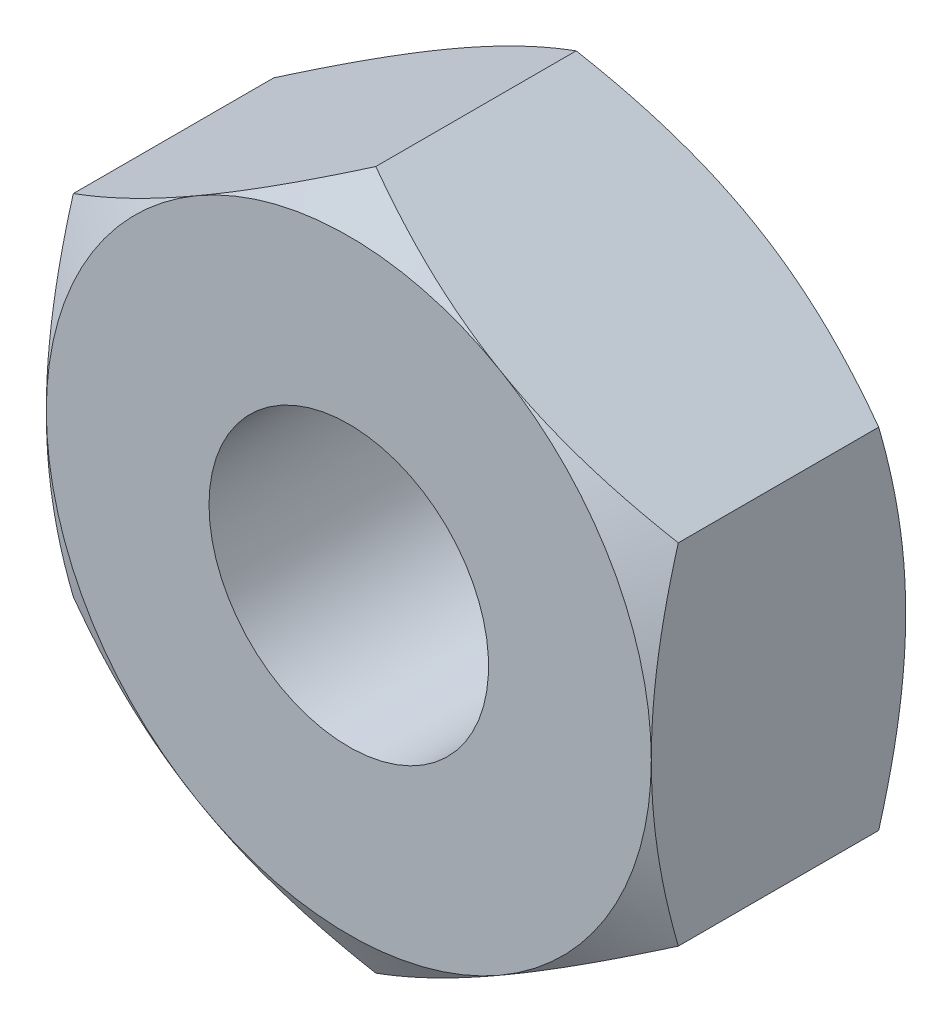
ISO-10303-21;
HEADER;
FILE_DESCRIPTION(('STEP AP214'),'2;1');
FILE_NAME('part.step','',(''),(''),'','','');
FILE_SCHEMA(('AUTOMOTIVE_DESIGN { 1 0 10303 214 1 1 1 1 }'));
ENDSEC;
DATA;
#1=APPLICATION_CONTEXT('core data for automotive mechanical design processes');
#2=APPLICATION_PROTOCOL_DEFINITION('international standard','automotive_design',2000,#1);
#3=PRODUCT_CONTEXT('',#1,'mechanical');
#4=PRODUCT('Part','Part','',(#3));
#5=PRODUCT_RELATED_PRODUCT_CATEGORY('part','',(#4));
#6=PRODUCT_DEFINITION_FORMATION('','',#4);
#7=PRODUCT_DEFINITION_CONTEXT('part definition',#1,'design');
#8=PRODUCT_DEFINITION('design','',#6,#7);
#9=PRODUCT_DEFINITION_SHAPE('','',#8);
#10=(LENGTH_UNIT() NAMED_UNIT(*) SI_UNIT(.MILLI.,.METRE.));
#11=(NAMED_UNIT(*) PLANE_ANGLE_UNIT() SI_UNIT($,.RADIAN.));
#12=(NAMED_UNIT(*) SI_UNIT($,.STERADIAN.) SOLID_ANGLE_UNIT());
#13=UNCERTAINTY_MEASURE_WITH_UNIT(LENGTH_MEASURE(1.E-05),#10,'distance_accuracy_value','');
#14=(GEOMETRIC_REPRESENTATION_CONTEXT(3) GLOBAL_UNCERTAINTY_ASSIGNED_CONTEXT((#13)) GLOBAL_UNIT_ASSIGNED_CONTEXT((#10,
#11,#12)) REPRESENTATION_CONTEXT('',''));
#15=CARTESIAN_POINT('',(0.,0.,0.));
#16=DIRECTION('',(0.,0.,1.));
#17=DIRECTION('',(1.,0.,0.));
#18=AXIS2_PLACEMENT_3D('',#15,#16,#17);
#19=CARTESIAN_POINT('',(-2.705,-3.12346495631587,0.));
#20=DIRECTION('',(0.,0.,1.));
#21=DIRECTION('',(1.,0.,0.));
#22=AXIS2_PLACEMENT_3D('',#19,#20,#21);
#23=PLANE('',#22);
#24=CARTESIAN_POINT('',(0.,0.,0.));
#25=DIRECTION('',(0.,0.,1.));
#26=DIRECTION('',(0.,-1.,0.));
#27=AXIS2_PLACEMENT_3D('',#24,#25,#26);
#28=CIRCLE('',#27,2.70500000000018);
#29=CARTESIAN_POINT('',(2.70500000000018,0.,0.));
#30=VERTEX_POINT('',#29);
#31=CARTESIAN_POINT('',(1.35250000000009,2.34259871723707,0.));
#32=VERTEX_POINT('',#31);
#33=EDGE_CURVE('E369',#30,#32,#28,.T.);
#34=ORIENTED_EDGE('',*,*,#33,.F.);
#35=CARTESIAN_POINT('',(0.,0.,0.));
#36=DIRECTION('',(0.,0.,1.));
#37=DIRECTION('',(1.,0.,0.));
#38=AXIS2_PLACEMENT_3D('',#35,#36,#37);
#39=CIRCLE('',#38,2.70500000000021);
#40=CARTESIAN_POINT('',(1.35250000000009,-2.34259871723706,0.));
#41=VERTEX_POINT('',#40);
#42=EDGE_CURVE('E12',#30,#41,#39,.F.);
#43=ORIENTED_EDGE('',*,*,#42,.T.);
#44=CARTESIAN_POINT('',(-1.35250000000009,-2.34259871723706,0.));
#45=VERTEX_POINT('',#44);
#46=EDGE_CURVE('E55',#41,#45,#39,.F.);
#47=ORIENTED_EDGE('',*,*,#46,.T.);
#48=CARTESIAN_POINT('',(-2.70500000000018,0.,0.));
#49=VERTEX_POINT('',#48);
#50=EDGE_CURVE('E646',#45,#49,#39,.F.);
#51=ORIENTED_EDGE('',*,*,#50,.T.);
#52=CARTESIAN_POINT('',(-1.35250000000009,2.34259871723707,0.));
#53=VERTEX_POINT('',#52);
#54=EDGE_CURVE('E651',#49,#53,#39,.F.);
#55=ORIENTED_EDGE('',*,*,#54,.T.);
#56=EDGE_CURVE('E56',#53,#32,#39,.F.);
#57=ORIENTED_EDGE('',*,*,#56,.T.);
#58=EDGE_LOOP('',(#34,#43,#47,#51,#55,#57));
#59=FACE_BOUND('',#58,.T.);
#60=CARTESIAN_POINT('',(0.,0.,0.));
#61=DIRECTION('',(0.,0.,-1.));
#62=DIRECTION('',(-1.,0.,0.));
#63=AXIS2_PLACEMENT_3D('',#60,#61,#62);
#64=CIRCLE('',#63,1.24999999999999);
#65=CARTESIAN_POINT('',(-1.24999999999999,0.,0.));
#66=VERTEX_POINT('',#65);
#67=EDGE_CURVE('E684',#66,#66,#64,.T.);
#68=ORIENTED_EDGE('',*,*,#67,.F.);
#69=EDGE_LOOP('',(#68));
#70=FACE_BOUND('',#69,.T.);
#71=ADVANCED_FACE('F45',(#59,#70),#23,.F.);
#72=CARTESIAN_POINT('',(-2.705,-3.12346495631587,2.275));
#73=DIRECTION('',(0.,0.,1.));
#74=DIRECTION('',(1.,0.,0.));
#75=AXIS2_PLACEMENT_3D('',#72,#73,#74);
#76=PLANE('',#75);
#77=CARTESIAN_POINT('',(0.,0.,2.275));
#78=DIRECTION('',(0.,0.,-1.));
#79=DIRECTION('',(0.,1.,0.));
#80=AXIS2_PLACEMENT_3D('',#77,#78,#79);
#81=CIRCLE('',#80,2.70500000000018);
#82=CARTESIAN_POINT('',(2.70500000000018,0.,2.275));
#83=VERTEX_POINT('',#82);
#84=CARTESIAN_POINT('',(1.35250000000009,-2.34259871723706,2.275));
#85=VERTEX_POINT('',#84);
#86=EDGE_CURVE('E212',#83,#85,#81,.T.);
#87=ORIENTED_EDGE('',*,*,#86,.F.);
#88=CARTESIAN_POINT('',(0.,0.,2.275));
#89=DIRECTION('',(0.,0.,1.));
#90=DIRECTION('',(1.,0.,0.));
#91=AXIS2_PLACEMENT_3D('',#88,#89,#90);
#92=CIRCLE('',#91,2.70500000000018);
#93=CARTESIAN_POINT('',(1.35250000000009,2.34259871723706,2.275));
#94=VERTEX_POINT('',#93);
#95=EDGE_CURVE('E188',#94,#83,#92,.F.);
#96=ORIENTED_EDGE('',*,*,#95,.F.);
#97=CARTESIAN_POINT('',(-1.35250000000009,2.34259871723706,2.275));
#98=VERTEX_POINT('',#97);
#99=EDGE_CURVE('E196',#98,#94,#92,.F.);
#100=ORIENTED_EDGE('',*,*,#99,.F.);
#101=CARTESIAN_POINT('',(-2.70500000000018,0.,2.275));
#102=VERTEX_POINT('',#101);
#103=EDGE_CURVE('E668',#102,#98,#92,.F.);
#104=ORIENTED_EDGE('',*,*,#103,.F.);
#105=CARTESIAN_POINT('',(-1.35250000000009,-2.34259871723707,2.275));
#106=VERTEX_POINT('',#105);
#107=EDGE_CURVE('E663',#106,#102,#92,.F.);
#108=ORIENTED_EDGE('',*,*,#107,.F.);
#109=EDGE_CURVE('E197',#85,#106,#92,.F.);
#110=ORIENTED_EDGE('',*,*,#109,.F.);
#111=EDGE_LOOP('',(#87,#96,#100,#104,#108,#110));
#112=FACE_BOUND('',#111,.T.);
#113=CARTESIAN_POINT('',(0.,0.,2.27500000000011));
#114=DIRECTION('',(0.,0.,-1.));
#115=DIRECTION('',(-1.,0.,0.));
#116=AXIS2_PLACEMENT_3D('',#113,#114,#115);
#117=CIRCLE('',#116,1.24999999999999);
#118=CARTESIAN_POINT('',(-1.24999999999999,0.,2.27500000000011));
#119=VERTEX_POINT('',#118);
#120=EDGE_CURVE('E455',#119,#119,#117,.T.);
#121=ORIENTED_EDGE('',*,*,#120,.T.);
#122=EDGE_LOOP('',(#121));
#123=FACE_BOUND('',#122,.T.);
#124=ADVANCED_FACE('F276',(#112,#123),#76,.T.);
#125=CARTESIAN_POINT('',(2.705,1.56173247815794,2.275));
#126=DIRECTION('',(-0.5,-0.866025403784439,0.));
#127=DIRECTION('',(0.866025403784439,-0.5,0.));
#128=AXIS2_PLACEMENT_3D('',#125,#126,#127);
#129=PLANE('',#128);
#130=DIRECTION('',(0.,0.,-1.));
#131=VECTOR('',#130,1.);
#132=CARTESIAN_POINT('',(2.705,1.56173247815794,2.275));
#133=LINE('',#132,#131);
#134=CARTESIAN_POINT('',(2.705,1.5617324781575,2.0333991448246));
#135=VERTEX_POINT('',#134);
#136=CARTESIAN_POINT('',(2.705,1.56173247815794,0.241600855175381));
#137=VERTEX_POINT('',#136);
#138=EDGE_CURVE('E397',#135,#137,#133,.T.);
#139=ORIENTED_EDGE('',*,*,#138,.T.);
#140=CARTESIAN_POINT('',(2.7052,1.5616170081041,0.241667525538895));
#141=CARTESIAN_POINT('',(2.58632825680687,1.63024764103569,0.202027774658812));
#142=CARTESIAN_POINT('',(2.46643042186858,1.69947068831257,0.165976659538721));
#143=CARTESIAN_POINT('',(2.2245585260602,1.83911549246694,0.103048601430402));
#144=CARTESIAN_POINT('',(2.10258016695549,1.90953973093135,0.0761939208943712));
#145=CARTESIAN_POINT('',(1.86013516676371,2.04951541705576,0.0343900483952202));
#146=CARTESIAN_POINT('',(1.73970583224188,2.11904532576026,0.0191626405785051));
#147=CARTESIAN_POINT('',(1.4982804023152,2.25843236271765,0.000983153261697077));
#148=CARTESIAN_POINT('',(1.37728518462861,2.32828898421966,-0.00198397922900774));
#149=CARTESIAN_POINT('',(1.15119223938183,2.45882380701976,0.0041834160497769));
#150=CARTESIAN_POINT('',(1.046060694013,2.51952153303878,0.0118036374938101));
#151=CARTESIAN_POINT('',(0.836482545838734,2.64052153330346,0.0359569039149233));
#152=CARTESIAN_POINT('',(0.732036668110149,2.7008233889258,0.052498202432594));
#153=CARTESIAN_POINT('',(0.52202628878509,2.82207293796174,0.0938508132151876));
#154=CARTESIAN_POINT('',(0.416488372042863,2.88300528260258,0.118837445864973));
#155=CARTESIAN_POINT('',(0.206986757533932,3.00396109613497,0.175547523369972));
#156=CARTESIAN_POINT('',(0.103020375018942,3.06398611506667,0.207257640313727));
#157=CARTESIAN_POINT('',(-0.000199999999999696,3.12358042636972,0.241667525538894));
#158=B_SPLINE_CURVE_WITH_KNOTS('',3,(#140,#141,#142,#143,#144,#145,#146,#147,#148,#149,#150,
#151,#152,#153,#154,#155,#156,#157),.UNSPECIFIED.,.F.,.F.,(4,2,2,2,2,2,2,2,4),(0.,
0.428779968479392,0.85859069626066,1.27776339794897,1.69642129218921,2.06097746545976,
2.425871496331,2.79886028151181,3.17111649317397),.UNSPECIFIED.);
#159=EDGE_CURVE('E72',#137,#32,#158,.T.);
#160=ORIENTED_EDGE('',*,*,#159,.T.);
#161=CARTESIAN_POINT('',(-3.75350792114482E-13,3.12346495631566,0.241600855175381));
#162=VERTEX_POINT('',#161);
#163=EDGE_CURVE('E166',#32,#162,#158,.T.);
#164=ORIENTED_EDGE('',*,*,#163,.T.);
#165=DIRECTION('',(0.,0.,-1.));
#166=VECTOR('',#165,1.);
#167=CARTESIAN_POINT('',(0.,3.12346495631587,2.275));
#168=LINE('',#167,#166);
#169=CARTESIAN_POINT('',(-3.76868675155961E-13,3.12346495631566,2.0333991448246));
#170=VERTEX_POINT('',#169);
#171=EDGE_CURVE('E180',#170,#162,#168,.T.);
#172=ORIENTED_EDGE('',*,*,#171,.F.);
#173=CARTESIAN_POINT('',(-0.0002,3.12358042636972,2.03333247446109));
#174=CARTESIAN_POINT('',(0.118671743193131,3.05494979343812,2.07297222534117));
#175=CARTESIAN_POINT('',(0.238569578131421,2.98572674616124,2.10902334046127));
#176=CARTESIAN_POINT('',(0.4804414739398,2.84608194200687,2.17195139856958));
#177=CARTESIAN_POINT('',(0.602419833044506,2.77565770354246,2.19880607910562));
#178=CARTESIAN_POINT('',(0.84486483323629,2.63568201741805,2.24060995160477));
#179=CARTESIAN_POINT('',(0.965294167758116,2.56615210871355,2.25583735942148));
#180=CARTESIAN_POINT('',(1.2067195976848,2.42676507175616,2.27401684673829));
#181=CARTESIAN_POINT('',(1.32771481537139,2.35690845025415,2.276983979229));
#182=CARTESIAN_POINT('',(1.55380776061817,2.22637362745405,2.27081658395021));
#183=CARTESIAN_POINT('',(1.658939305987,2.16567590143503,2.26319636250618));
#184=CARTESIAN_POINT('',(1.86851745416126,2.04467590117035,2.23904309608506));
#185=CARTESIAN_POINT('',(1.97296333188985,1.98437404554801,2.22250179756739));
#186=CARTESIAN_POINT('',(2.18297371121491,1.86312449651207,2.1811491867848));
#187=CARTESIAN_POINT('',(2.28851162795713,1.80219215187123,2.15616255413501));
#188=CARTESIAN_POINT('',(2.49801324246607,1.68123633833884,2.09945247663001));
#189=CARTESIAN_POINT('',(2.60197962498106,1.62121131940714,2.06774235968626));
#190=CARTESIAN_POINT('',(2.7052,1.5616170081041,2.03333247446109));
#191=B_SPLINE_CURVE_WITH_KNOTS('',3,(#173,#174,#175,#176,#177,#178,#179,#180,#181,#182,#183,
#184,#185,#186,#187,#188,#189,#190),.UNSPECIFIED.,.F.,.F.,(4,2,2,2,2,2,2,2,4),(0.,
0.428779968479393,0.858590696260662,1.27776339794898,1.69642129218921,2.06097746545977,
2.425871496331,2.79886028151182,3.17111649317397),.UNSPECIFIED.);
#192=EDGE_CURVE('E248',#170,#94,#191,.T.);
#193=ORIENTED_EDGE('',*,*,#192,.T.);
#194=EDGE_CURVE('E240',#94,#135,#191,.T.);
#195=ORIENTED_EDGE('',*,*,#194,.T.);
#196=EDGE_LOOP('',(#139,#160,#164,#172,#193,#195));
#197=FACE_BOUND('',#196,.T.);
#198=ADVANCED_FACE('F47',(#197),#129,.F.);
#199=CARTESIAN_POINT('',(0.,3.12346495631587,2.275));
#200=DIRECTION('',(0.5,-0.866025403784439,0.));
#201=DIRECTION('',(0.866025403784439,0.5,0.));
#202=AXIS2_PLACEMENT_3D('',#199,#200,#201);
#203=PLANE('',#202);
#204=ORIENTED_EDGE('',*,*,#171,.T.);
#205=CARTESIAN_POINT('',(0.000200000000000045,3.12358042636972,0.241667525538894));
#206=CARTESIAN_POINT('',(-0.118671743193131,3.05494979343812,0.202027774658813));
#207=CARTESIAN_POINT('',(-0.238569578131423,2.98572674616124,0.165976659538721));
#208=CARTESIAN_POINT('',(-0.480441473939802,2.84608194200687,0.103048601430403));
#209=CARTESIAN_POINT('',(-0.602419833044508,2.77565770354246,0.0761939208943721));
#210=CARTESIAN_POINT('',(-0.844864833236292,2.63568201741805,0.0343900483952212));
#211=CARTESIAN_POINT('',(-0.965294167758118,2.56615210871355,0.0191626405785064));
#212=CARTESIAN_POINT('',(-1.2067195976848,2.42676507175616,0.000983153261697867));
#213=CARTESIAN_POINT('',(-1.32771481537139,2.35690845025415,-0.00198397922900772));
#214=CARTESIAN_POINT('',(-1.55380776061817,2.22637362745405,0.00418341604977735));
#215=CARTESIAN_POINT('',(-1.658939305987,2.16567590143503,0.0118036374938115));
#216=CARTESIAN_POINT('',(-1.86851745416126,2.04467590117036,0.0359569039149254));
#217=CARTESIAN_POINT('',(-1.97296333188985,1.98437404554801,0.0524982024325958));
#218=CARTESIAN_POINT('',(-2.18297371121491,1.86312449651207,0.0938508132151894));
#219=CARTESIAN_POINT('',(-2.28851162795714,1.80219215187123,0.118837445864974));
#220=CARTESIAN_POINT('',(-2.49801324246607,1.68123633833884,0.175547523369974));
#221=CARTESIAN_POINT('',(-2.60197962498106,1.62121131940714,0.207257640313728));
#222=CARTESIAN_POINT('',(-2.7052,1.5616170081041,0.241667525538895));
#223=B_SPLINE_CURVE_WITH_KNOTS('',3,(#205,#206,#207,#208,#209,#210,#211,#212,#213,#214,#215,
#216,#217,#218,#219,#220,#221,#222),.UNSPECIFIED.,.F.,.F.,(4,2,2,2,2,2,2,2,4),(0.,
0.428779968479393,0.858590696260661,1.27776339794898,1.69642129218921,2.06097746545976,
2.425871496331,2.79886028151182,3.17111649317397),.UNSPECIFIED.);
#224=EDGE_CURVE('E162',#162,#53,#223,.T.);
#225=ORIENTED_EDGE('',*,*,#224,.T.);
#226=CARTESIAN_POINT('',(-2.705,1.56173247815751,0.241600855175381));
#227=VERTEX_POINT('',#226);
#228=EDGE_CURVE('E173',#53,#227,#223,.T.);
#229=ORIENTED_EDGE('',*,*,#228,.T.);
#230=DIRECTION('',(0.,0.,-1.));
#231=VECTOR('',#230,1.);
#232=CARTESIAN_POINT('',(-2.705,1.56173247815794,2.275));
#233=LINE('',#232,#231);
#234=CARTESIAN_POINT('',(-2.705,1.5617324781575,2.0333991448246));
#235=VERTEX_POINT('',#234);
#236=EDGE_CURVE('E189',#235,#227,#233,.T.);
#237=ORIENTED_EDGE('',*,*,#236,.F.);
#238=CARTESIAN_POINT('',(-2.7052,1.5616170081041,2.03333247446109));
#239=CARTESIAN_POINT('',(-2.58632825680687,1.63024764103569,2.07297222534117));
#240=CARTESIAN_POINT('',(-2.46643042186858,1.69947068831257,2.10902334046126));
#241=CARTESIAN_POINT('',(-2.2245585260602,1.83911549246694,2.17195139856958));
#242=CARTESIAN_POINT('',(-2.10258016695549,1.90953973093135,2.19880607910561));
#243=CARTESIAN_POINT('',(-1.86013516676371,2.04951541705576,2.24060995160476));
#244=CARTESIAN_POINT('',(-1.73970583224188,2.11904532576026,2.25583735942148));
#245=CARTESIAN_POINT('',(-1.4982804023152,2.25843236271765,2.27401684673829));
#246=CARTESIAN_POINT('',(-1.37728518462861,2.32828898421966,2.276983979229));
#247=CARTESIAN_POINT('',(-1.15119223938183,2.45882380701976,2.27081658395021));
#248=CARTESIAN_POINT('',(-1.046060694013,2.51952153303878,2.26319636250618));
#249=CARTESIAN_POINT('',(-0.836482545838736,2.64052153330346,2.23904309608506));
#250=CARTESIAN_POINT('',(-0.73203666811015,2.7008233889258,2.22250179756739));
#251=CARTESIAN_POINT('',(-0.52202628878509,2.82207293796174,2.1811491867848));
#252=CARTESIAN_POINT('',(-0.416488372042864,2.88300528260258,2.15616255413501));
#253=CARTESIAN_POINT('',(-0.206986757533933,3.00396109613497,2.09945247663001));
#254=CARTESIAN_POINT('',(-0.103020375018942,3.06398611506667,2.06774235968626));
#255=CARTESIAN_POINT('',(0.000199999999999991,3.12358042636972,2.03333247446109));
#256=B_SPLINE_CURVE_WITH_KNOTS('',3,(#238,#239,#240,#241,#242,#243,#244,#245,#246,#247,#248,
#249,#250,#251,#252,#253,#254,#255),.UNSPECIFIED.,.F.,.F.,(4,2,2,2,2,2,2,2,4),(0.,
0.428779968479392,0.85859069626066,1.27776339794897,1.69642129218921,2.06097746545976,
2.425871496331,2.79886028151182,3.17111649317397),.UNSPECIFIED.);
#257=EDGE_CURVE('E290',#235,#98,#256,.T.);
#258=ORIENTED_EDGE('',*,*,#257,.T.);
#259=EDGE_CURVE('E186',#98,#170,#256,.T.);
#260=ORIENTED_EDGE('',*,*,#259,.T.);
#261=EDGE_LOOP('',(#204,#225,#229,#237,#258,#260));
#262=FACE_BOUND('',#261,.T.);
#263=ADVANCED_FACE('F184',(#262),#203,.F.);
#264=CARTESIAN_POINT('',(-2.705,1.56173247815794,2.275));
#265=DIRECTION('',(1.,0.,0.));
#266=DIRECTION('',(0.,0.,-1.));
#267=AXIS2_PLACEMENT_3D('',#264,#265,#266);
#268=PLANE('',#267);
#269=ORIENTED_EDGE('',*,*,#236,.T.);
#270=CARTESIAN_POINT('',(-2.705,-4.14194468320971,1.29441473786508));
#271=CARTESIAN_POINT('',(-2.705,-4.02317988672405,1.23702102810717));
#272=CARTESIAN_POINT('',(-2.705,-3.90413429104438,1.18019785932576));
#273=CARTESIAN_POINT('',(-2.705,-3.66532967331094,1.06801863052249));
#274=CARTESIAN_POINT('',(-2.705,-3.54557053207429,1.0126628245142));
#275=CARTESIAN_POINT('',(-2.705,-3.30454006602888,0.903452730644108));
#276=CARTESIAN_POINT('',(-2.705,-3.18326400948936,0.849608848162089));
#277=CARTESIAN_POINT('',(-2.705,-2.93971511372843,0.74423380839109));
#278=CARTESIAN_POINT('',(-2.705,-2.81744232685824,0.692702530550365));
#279=CARTESIAN_POINT('',(-2.705,-2.57018757936298,0.591955877329658));
#280=CARTESIAN_POINT('',(-2.705,-2.44519078771405,0.542776700951388));
#281=CARTESIAN_POINT('',(-2.705,-2.19372285645103,0.448270051186636));
#282=CARTESIAN_POINT('',(-2.705,-2.06725155458041,0.402943006329631));
#283=CARTESIAN_POINT('',(-2.705,-1.81289315219116,0.31735854487658));
#284=CARTESIAN_POINT('',(-2.705,-1.68500971560817,0.277090350272725));
#285=CARTESIAN_POINT('',(-2.705,-1.42742481197496,0.202931369863301));
#286=CARTESIAN_POINT('',(-2.705,-1.29772393384363,0.169038567293947));
#287=CARTESIAN_POINT('',(-2.705,-1.03641556112155,0.109275775087652));
#288=CARTESIAN_POINT('',(-2.705,-0.90480756861399,0.0834079216280642));
#289=CARTESIAN_POINT('',(-2.705,-0.64000484337124,0.0414367020423963));
#290=CARTESIAN_POINT('',(-2.705,-0.506810109233279,0.0253333445493577));
#291=CARTESIAN_POINT('',(-2.705,-0.240374407985766,0.00431570114218606));
#292=CARTESIAN_POINT('',(-2.705,-0.107139174127177,-0.000669420389776056));
#293=CARTESIAN_POINT('',(-2.705,0.159237997892234,0.000814249885845152));
#294=CARTESIAN_POINT('',(-2.705,0.292379951293829,0.00728006848878362));
#295=CARTESIAN_POINT('',(-2.705,0.519739129571369,0.0276442442823647));
#296=CARTESIAN_POINT('',(-2.705,0.614207185680716,0.0388906614496169));
#297=CARTESIAN_POINT('',(-2.705,0.802413560541705,0.0664168187468656));
#298=CARTESIAN_POINT('',(-2.705,0.896151761814054,0.0826973526856829));
#299=CARTESIAN_POINT('',(-2.705,1.1761951698751,0.138235691729974));
#300=CARTESIAN_POINT('',(-2.705,1.36118771969967,0.184175934444861));
#301=CARTESIAN_POINT('',(-2.705,1.6380009360096,0.263410437988058));
#302=CARTESIAN_POINT('',(-2.705,1.73126448964368,0.291946553149899));
#303=CARTESIAN_POINT('',(-2.705,1.91681817592182,0.351842447378765));
#304=CARTESIAN_POINT('',(-2.705,2.00910893159028,0.38320027887112));
#305=CARTESIAN_POINT('',(-2.705,2.19233109149002,0.448087104070347));
#306=CARTESIAN_POINT('',(-2.705,2.28326722311366,0.481602883540461));
#307=CARTESIAN_POINT('',(-2.705,2.46443394354455,0.550601636750575));
#308=CARTESIAN_POINT('',(-2.705,2.55466423014172,0.586085405563569));
#309=CARTESIAN_POINT('',(-2.705,2.64456826439522,0.622358965673456));
#310=B_SPLINE_CURVE_WITH_KNOTS('',3,(#270,#271,#272,#273,#274,#275,#276,#277,#278,#279,#280,
#281,#282,#283,#284,#285,#286,#287,#288,#289,#290,#291,#292,#293,#294,#295,#296,#297,#298,#299,
#300,#301,#302,#303,#304,#305,#306,#307,#308,#309),.UNSPECIFIED.,.F.,.F.,(4,2,2,2,2,2,2,2,2,2,2,
2,2,2,2,2,2,2,2,4),(0.,0.395722424699987,0.791512910942833,1.18956834629363,1.5876030076013,
1.99052429924571,2.39349035526257,2.79558277251787,3.19754777891023,3.59961969354677,
4.0016919636649,4.4011951755885,4.80059467282561,5.08586080233291,5.37117193722232,
5.94221883532025,6.23479021883221,6.52716119349774,6.81788650789181,7.10873014400924),.UNSPECIFIED.);
#311=EDGE_CURVE('E312',#227,#49,#310,.F.);
#312=ORIENTED_EDGE('',*,*,#311,.T.);
#313=CARTESIAN_POINT('',(-2.70499999999962,-1.56173247815815,0.241600855175382));
#314=VERTEX_POINT('',#313);
#315=EDGE_CURVE('E313',#49,#314,#310,.F.);
#316=ORIENTED_EDGE('',*,*,#315,.T.);
#317=DIRECTION('',(0.,0.,-1.));
#318=VECTOR('',#317,1.);
#319=CARTESIAN_POINT('',(-2.705,-1.56173247815794,2.275));
#320=LINE('',#319,#318);
#321=CARTESIAN_POINT('',(-2.70499999999962,-1.56173247815815,2.0333991448246));
#322=VERTEX_POINT('',#321);
#323=EDGE_CURVE('E199',#322,#314,#320,.T.);
#324=ORIENTED_EDGE('',*,*,#323,.F.);
#325=CARTESIAN_POINT('',(-2.705,-4.14194468320971,0.980585262134904));
#326=CARTESIAN_POINT('',(-2.705,-4.02317988672405,1.03797897189282));
#327=CARTESIAN_POINT('',(-2.705,-3.90413429104438,1.09480214067423));
#328=CARTESIAN_POINT('',(-2.705,-3.66532967331094,1.2069813694775));
#329=CARTESIAN_POINT('',(-2.705,-3.54557053207429,1.26233717548579));
#330=CARTESIAN_POINT('',(-2.705,-3.30454006602888,1.37154726935588));
#331=CARTESIAN_POINT('',(-2.705,-3.18326400948937,1.4253911518379));
#332=CARTESIAN_POINT('',(-2.705,-2.93971511372843,1.5307661916089));
#333=CARTESIAN_POINT('',(-2.705,-2.81744232685824,1.58229746944962));
#334=CARTESIAN_POINT('',(-2.705,-2.57018757936298,1.68304412267033));
#335=CARTESIAN_POINT('',(-2.705,-2.44519078771405,1.7322232990486));
#336=CARTESIAN_POINT('',(-2.705,-2.19372285645103,1.82672994881335));
#337=CARTESIAN_POINT('',(-2.705,-2.06725155458041,1.87205699367036));
#338=CARTESIAN_POINT('',(-2.705,-1.81289315219116,1.95764145512341));
#339=CARTESIAN_POINT('',(-2.705,-1.68500971560817,1.99790964972726));
#340=CARTESIAN_POINT('',(-2.705,-1.42742481197495,2.07206863013669));
#341=CARTESIAN_POINT('',(-2.705,-1.29772393384363,2.10596143270604));
#342=CARTESIAN_POINT('',(-2.705,-1.03641556112155,2.16572422491234));
#343=CARTESIAN_POINT('',(-2.705,-0.904807568613988,2.19159207837192));
#344=CARTESIAN_POINT('',(-2.705,-0.640004843371237,2.23356329795759));
#345=CARTESIAN_POINT('',(-2.705,-0.506810109233276,2.24966665545063));
#346=CARTESIAN_POINT('',(-2.705,-0.240374407985765,2.2706842988578));
#347=CARTESIAN_POINT('',(-2.705,-0.107139174127176,2.27566942038976));
#348=CARTESIAN_POINT('',(-2.705,0.159237997892235,2.27418575011414));
#349=CARTESIAN_POINT('',(-2.705,0.29237995129383,2.26771993151121));
#350=CARTESIAN_POINT('',(-2.705,0.51973912957137,2.24735575571762));
#351=CARTESIAN_POINT('',(-2.705,0.614207185680717,2.23610933855037));
#352=CARTESIAN_POINT('',(-2.705,0.802413560541706,2.20858318125312));
#353=CARTESIAN_POINT('',(-2.705,0.896151761814055,2.1923026473143));
#354=CARTESIAN_POINT('',(-2.705,1.1761951698751,2.13676430827001));
#355=CARTESIAN_POINT('',(-2.705,1.36118771969968,2.09082406555513));
#356=CARTESIAN_POINT('',(-2.705,1.6380009360096,2.01158956201193));
#357=CARTESIAN_POINT('',(-2.705,1.73126448964369,1.98305344685009));
#358=CARTESIAN_POINT('',(-2.705,1.91681817592182,1.92315755262122));
#359=CARTESIAN_POINT('',(-2.705,2.00910893159028,1.89179972112887));
#360=CARTESIAN_POINT('',(-2.705,2.19233109149003,1.82691289592964));
#361=CARTESIAN_POINT('',(-2.705,2.28326722311366,1.79339711645952));
#362=CARTESIAN_POINT('',(-2.705,2.46443394354455,1.72439836324941));
#363=CARTESIAN_POINT('',(-2.705,2.55466423014172,1.68891459443642));
#364=CARTESIAN_POINT('',(-2.705,2.64456826439522,1.65264103432653));
#365=B_SPLINE_CURVE_WITH_KNOTS('',3,(#325,#326,#327,#328,#329,#330,#331,#332,#333,#334,#335,
#336,#337,#338,#339,#340,#341,#342,#343,#344,#345,#346,#347,#348,#349,#350,#351,#352,#353,#354,
#355,#356,#357,#358,#359,#360,#361,#362,#363,#364),.UNSPECIFIED.,.F.,.F.,(4,2,2,2,2,2,2,2,2,2,2,
2,2,2,2,2,2,2,2,4),(0.,0.395722424699986,0.791512910942832,1.18956834629363,1.58760300760131,
1.99052429924571,2.39349035526257,2.79558277251787,3.19754777891023,3.59961969354677,
4.0016919636649,4.4011951755885,4.80059467282561,5.08586080233291,5.37117193722232,
5.94221883532025,6.23479021883222,6.52716119349775,6.81788650789181,7.10873014400924),.UNSPECIFIED.);
#366=EDGE_CURVE('E418',#322,#102,#365,.T.);
#367=ORIENTED_EDGE('',*,*,#366,.T.);
#368=EDGE_CURVE('E291',#102,#235,#365,.T.);
#369=ORIENTED_EDGE('',*,*,#368,.T.);
#370=EDGE_LOOP('',(#269,#312,#316,#324,#367,#369));
#371=FACE_BOUND('',#370,.T.);
#372=ADVANCED_FACE('F302',(#371),#268,.F.);
#373=CARTESIAN_POINT('',(-2.705,-1.56173247815794,2.275));
#374=DIRECTION('',(0.5,0.866025403784439,0.));
#375=DIRECTION('',(-0.866025403784439,0.5,0.));
#376=AXIS2_PLACEMENT_3D('',#373,#374,#375);
#377=PLANE('',#376);
#378=ORIENTED_EDGE('',*,*,#323,.T.);
#379=CARTESIAN_POINT('',(-2.7052,-1.5616170081041,0.241667525538895));
#380=CARTESIAN_POINT('',(-2.58632825680687,-1.63024764103569,0.202027774658813));
#381=CARTESIAN_POINT('',(-2.46643042186858,-1.69947068831257,0.165976659538721));
#382=CARTESIAN_POINT('',(-2.2245585260602,-1.83911549246694,0.103048601430403));
#383=CARTESIAN_POINT('',(-2.10258016695549,-1.90953973093135,0.0761939208943725));
#384=CARTESIAN_POINT('',(-1.86013516676371,-2.04951541705576,0.0343900483952213));
#385=CARTESIAN_POINT('',(-1.73970583224188,-2.11904532576026,0.019162640578506));
#386=CARTESIAN_POINT('',(-1.4982804023152,-2.25843236271765,0.000983153261697725));
#387=CARTESIAN_POINT('',(-1.37728518462861,-2.32828898421966,-0.00198397922900707));
#388=CARTESIAN_POINT('',(-1.15119223938183,-2.45882380701976,0.00418341604977802));
#389=CARTESIAN_POINT('',(-1.046060694013,-2.51952153303878,0.0118036374938116));
#390=CARTESIAN_POINT('',(-0.836482545838734,-2.64052153330346,0.0359569039149248));
#391=CARTESIAN_POINT('',(-0.732036668110149,-2.7008233889258,0.0524982024325952));
#392=CARTESIAN_POINT('',(-0.52202628878509,-2.82207293796174,0.0938508132151887));
#393=CARTESIAN_POINT('',(-0.416488372042864,-2.88300528260258,0.118837445864974));
#394=CARTESIAN_POINT('',(-0.206986757533934,-3.00396109613497,0.175547523369974));
#395=CARTESIAN_POINT('',(-0.103020375018943,-3.06398611506667,0.207257640313728));
#396=CARTESIAN_POINT('',(0.000199999999999665,-3.12358042636971,0.241667525538895));
#397=B_SPLINE_CURVE_WITH_KNOTS('',3,(#379,#380,#381,#382,#383,#384,#385,#386,#387,#388,#389,
#390,#391,#392,#393,#394,#395,#396),.UNSPECIFIED.,.F.,.F.,(4,2,2,2,2,2,2,2,4),(0.,
0.428779968479393,0.85859069626066,1.27776339794898,1.69642129218921,2.06097746545976,
2.425871496331,2.79886028151181,3.17111649317396),.UNSPECIFIED.);
#398=EDGE_CURVE('E334',#314,#45,#397,.T.);
#399=ORIENTED_EDGE('',*,*,#398,.T.);
#400=CARTESIAN_POINT('',(3.7621815385247E-13,-3.12346495631566,0.241600855175382));
#401=VERTEX_POINT('',#400);
#402=EDGE_CURVE('E325',#45,#401,#397,.T.);
#403=ORIENTED_EDGE('',*,*,#402,.T.);
#404=DIRECTION('',(0.,0.,-1.));
#405=VECTOR('',#404,1.);
#406=CARTESIAN_POINT('',(0.,-3.12346495631587,2.275));
#407=LINE('',#406,#405);
#408=CARTESIAN_POINT('',(3.75567632548979E-13,-3.12346495631566,2.0333991448246));
#409=VERTEX_POINT('',#408);
#410=EDGE_CURVE('E396',#409,#401,#407,.T.);
#411=ORIENTED_EDGE('',*,*,#410,.F.);
#412=CARTESIAN_POINT('',(0.0002,-3.12358042636971,2.03333247446109));
#413=CARTESIAN_POINT('',(-0.118671743193132,-3.05494979343811,2.07297222534118));
#414=CARTESIAN_POINT('',(-0.238569578131423,-2.98572674616124,2.10902334046127));
#415=CARTESIAN_POINT('',(-0.480441473939802,-2.84608194200687,2.17195139856958));
#416=CARTESIAN_POINT('',(-0.602419833044508,-2.77565770354246,2.19880607910562));
#417=CARTESIAN_POINT('',(-0.844864833236291,-2.63568201741805,2.24060995160477));
#418=CARTESIAN_POINT('',(-0.965294167758117,-2.56615210871355,2.25583735942148));
#419=CARTESIAN_POINT('',(-1.2067195976848,-2.42676507175616,2.27401684673829));
#420=CARTESIAN_POINT('',(-1.32771481537139,-2.35690845025415,2.276983979229));
#421=CARTESIAN_POINT('',(-1.55380776061817,-2.22637362745405,2.27081658395021));
#422=CARTESIAN_POINT('',(-1.65893930598699,-2.16567590143503,2.26319636250618));
#423=CARTESIAN_POINT('',(-1.86851745416126,-2.04467590117035,2.23904309608506));
#424=CARTESIAN_POINT('',(-1.97296333188985,-1.98437404554801,2.22250179756739));
#425=CARTESIAN_POINT('',(-2.18297371121491,-1.86312449651207,2.1811491867848));
#426=CARTESIAN_POINT('',(-2.28851162795713,-1.80219215187123,2.15616255413501));
#427=CARTESIAN_POINT('',(-2.49801324246606,-1.68123633833884,2.09945247663001));
#428=CARTESIAN_POINT('',(-2.60197962498106,-1.62121131940714,2.06774235968626));
#429=CARTESIAN_POINT('',(-2.7052,-1.5616170081041,2.03333247446109));
#430=B_SPLINE_CURVE_WITH_KNOTS('',3,(#412,#413,#414,#415,#416,#417,#418,#419,#420,#421,#422,
#423,#424,#425,#426,#427,#428,#429),.UNSPECIFIED.,.F.,.F.,(4,2,2,2,2,2,2,2,4),(0.,
0.428779968479392,0.858590696260659,1.27776339794897,1.69642129218921,2.06097746545976,
2.42587149633099,2.79886028151181,3.17111649317396),.UNSPECIFIED.);
#431=EDGE_CURVE('E256',#409,#106,#430,.T.);
#432=ORIENTED_EDGE('',*,*,#431,.T.);
#433=EDGE_CURVE('E412',#106,#322,#430,.T.);
#434=ORIENTED_EDGE('',*,*,#433,.T.);
#435=EDGE_LOOP('',(#378,#399,#403,#411,#432,#434));
#436=FACE_BOUND('',#435,.T.);
#437=ADVANCED_FACE('F344',(#436),#377,.F.);
#438=CARTESIAN_POINT('',(0.,-3.12346495631587,2.275));
#439=DIRECTION('',(-0.5,0.866025403784439,0.));
#440=DIRECTION('',(-0.866025403784439,-0.5,0.));
#441=AXIS2_PLACEMENT_3D('',#438,#439,#440);
#442=PLANE('',#441);
#443=ORIENTED_EDGE('',*,*,#410,.T.);
#444=CARTESIAN_POINT('',(-0.000200000000000053,-3.12358042636972,0.241667525538895));
#445=CARTESIAN_POINT('',(0.118671743193131,-3.05494979343812,0.202027774658814));
#446=CARTESIAN_POINT('',(0.238569578131423,-2.98572674616124,0.165976659538723));
#447=CARTESIAN_POINT('',(0.480441473939802,-2.84608194200687,0.103048601430404));
#448=CARTESIAN_POINT('',(0.602419833044508,-2.77565770354246,0.0761939208943735));
#449=CARTESIAN_POINT('',(0.844864833236293,-2.63568201741805,0.0343900483952224));
#450=CARTESIAN_POINT('',(0.965294167758119,-2.56615210871355,0.0191626405785076));
#451=CARTESIAN_POINT('',(1.2067195976848,-2.42676507175616,0.000983153261698853));
#452=CARTESIAN_POINT('',(1.32771481537139,-2.35690845025415,-0.00198397922900683));
#453=CARTESIAN_POINT('',(1.55380776061817,-2.22637362745405,0.00418341604977826));
#454=CARTESIAN_POINT('',(1.658939305987,-2.16567590143503,0.0118036374938125));
#455=CARTESIAN_POINT('',(1.86851745416127,-2.04467590117035,0.0359569039149264));
#456=CARTESIAN_POINT('',(1.97296333188985,-1.98437404554801,0.0524982024325968));
#457=CARTESIAN_POINT('',(2.18297371121491,-1.86312449651207,0.0938508132151903));
#458=CARTESIAN_POINT('',(2.28851162795714,-1.80219215187123,0.118837445864975));
#459=CARTESIAN_POINT('',(2.49801324246607,-1.68123633833884,0.175547523369975));
#460=CARTESIAN_POINT('',(2.60197962498106,-1.62121131940714,0.207257640313729));
#461=CARTESIAN_POINT('',(2.7052,-1.5616170081041,0.241667525538895));
#462=B_SPLINE_CURVE_WITH_KNOTS('',3,(#444,#445,#446,#447,#448,#449,#450,#451,#452,#453,#454,
#455,#456,#457,#458,#459,#460,#461),.UNSPECIFIED.,.F.,.F.,(4,2,2,2,2,2,2,2,4),(0.,
0.428779968479393,0.858590696260662,1.27776339794898,1.69642129218921,2.06097746545977,
2.425871496331,2.79886028151182,3.17111649317397),.UNSPECIFIED.);
#463=EDGE_CURVE('E335',#401,#41,#462,.T.);
#464=ORIENTED_EDGE('',*,*,#463,.T.);
#465=CARTESIAN_POINT('',(2.705,-1.5617324781575,0.241600855175382));
#466=VERTEX_POINT('',#465);
#467=EDGE_CURVE('E336',#41,#466,#462,.T.);
#468=ORIENTED_EDGE('',*,*,#467,.T.);
#469=DIRECTION('',(0.,0.,-1.));
#470=VECTOR('',#469,1.);
#471=CARTESIAN_POINT('',(2.705,-1.56173247815794,2.275));
#472=LINE('',#471,#470);
#473=CARTESIAN_POINT('',(2.705,-1.56173247815794,2.0333991448246));
#474=VERTEX_POINT('',#473);
#475=EDGE_CURVE('E391',#474,#466,#472,.T.);
#476=ORIENTED_EDGE('',*,*,#475,.F.);
#477=CARTESIAN_POINT('',(2.7052,-1.5616170081041,2.03333247446109));
#478=CARTESIAN_POINT('',(2.58632825680687,-1.63024764103569,2.07297222534117));
#479=CARTESIAN_POINT('',(2.46643042186858,-1.69947068831257,2.10902334046126));
#480=CARTESIAN_POINT('',(2.2245585260602,-1.83911549246694,2.17195139856958));
#481=CARTESIAN_POINT('',(2.10258016695549,-1.90953973093135,2.19880607910561));
#482=CARTESIAN_POINT('',(1.86013516676371,-2.04951541705576,2.24060995160476));
#483=CARTESIAN_POINT('',(1.73970583224188,-2.11904532576026,2.25583735942148));
#484=CARTESIAN_POINT('',(1.4982804023152,-2.25843236271766,2.27401684673829));
#485=CARTESIAN_POINT('',(1.37728518462861,-2.32828898421966,2.276983979229));
#486=CARTESIAN_POINT('',(1.15119223938183,-2.45882380701976,2.27081658395021));
#487=CARTESIAN_POINT('',(1.046060694013,-2.51952153303878,2.26319636250618));
#488=CARTESIAN_POINT('',(0.836482545838736,-2.64052153330346,2.23904309608506));
#489=CARTESIAN_POINT('',(0.73203666811015,-2.7008233889258,2.22250179756739));
#490=CARTESIAN_POINT('',(0.522026288785091,-2.82207293796174,2.1811491867848));
#491=CARTESIAN_POINT('',(0.416488372042865,-2.88300528260258,2.15616255413501));
#492=CARTESIAN_POINT('',(0.206986757533935,-3.00396109613497,2.09945247663001));
#493=CARTESIAN_POINT('',(0.103020375018944,-3.06398611506667,2.06774235968626));
#494=CARTESIAN_POINT('',(-0.000199999999999768,-3.12358042636971,2.03333247446109));
#495=B_SPLINE_CURVE_WITH_KNOTS('',3,(#477,#478,#479,#480,#481,#482,#483,#484,#485,#486,#487,
#488,#489,#490,#491,#492,#493,#494),.UNSPECIFIED.,.F.,.F.,(4,2,2,2,2,2,2,2,4),(0.,
0.428779968479393,0.858590696260661,1.27776339794898,1.69642129218921,2.06097746545976,
2.425871496331,2.79886028151181,3.17111649317396),.UNSPECIFIED.);
#496=EDGE_CURVE('E249',#474,#85,#495,.T.);
#497=ORIENTED_EDGE('',*,*,#496,.T.);
#498=EDGE_CURVE('E702',#85,#409,#495,.T.);
#499=ORIENTED_EDGE('',*,*,#498,.T.);
#500=EDGE_LOOP('',(#443,#464,#468,#476,#497,#499));
#501=FACE_BOUND('',#500,.T.);
#502=ADVANCED_FACE('F347',(#501),#442,.F.);
#503=CARTESIAN_POINT('',(2.705,-1.56173247815794,2.275));
#504=DIRECTION('',(-1.,0.,0.));
#505=DIRECTION('',(0.,0.,1.));
#506=AXIS2_PLACEMENT_3D('',#503,#504,#505);
#507=PLANE('',#506);
#508=ORIENTED_EDGE('',*,*,#475,.T.);
#509=CARTESIAN_POINT('',(2.705,-4.14194468320971,1.29441473786508));
#510=CARTESIAN_POINT('',(2.705,-4.02317988672405,1.23702102810717));
#511=CARTESIAN_POINT('',(2.705,-3.90413429104438,1.18019785932576));
#512=CARTESIAN_POINT('',(2.705,-3.66532967331094,1.06801863052249));
#513=CARTESIAN_POINT('',(2.705,-3.54557053207429,1.0126628245142));
#514=CARTESIAN_POINT('',(2.705,-3.30454006602888,0.903452730644108));
#515=CARTESIAN_POINT('',(2.705,-3.18326400948936,0.849608848162089));
#516=CARTESIAN_POINT('',(2.705,-2.93971511372843,0.74423380839109));
#517=CARTESIAN_POINT('',(2.705,-2.81744232685824,0.692702530550365));
#518=CARTESIAN_POINT('',(2.705,-2.57018757936298,0.591955877329658));
#519=CARTESIAN_POINT('',(2.705,-2.44519078771405,0.542776700951388));
#520=CARTESIAN_POINT('',(2.705,-2.19372285645103,0.448270051186636));
#521=CARTESIAN_POINT('',(2.705,-2.06725155458041,0.402943006329631));
#522=CARTESIAN_POINT('',(2.705,-1.81289315219116,0.31735854487658));
#523=CARTESIAN_POINT('',(2.705,-1.68500971560817,0.277090350272725));
#524=CARTESIAN_POINT('',(2.705,-1.42742481197496,0.202931369863301));
#525=CARTESIAN_POINT('',(2.705,-1.29772393384363,0.169038567293947));
#526=CARTESIAN_POINT('',(2.705,-1.03641556112155,0.109275775087652));
#527=CARTESIAN_POINT('',(2.705,-0.90480756861399,0.0834079216280642));
#528=CARTESIAN_POINT('',(2.705,-0.64000484337124,0.0414367020423963));
#529=CARTESIAN_POINT('',(2.705,-0.506810109233279,0.0253333445493577));
#530=CARTESIAN_POINT('',(2.705,-0.240374407985766,0.00431570114218606));
#531=CARTESIAN_POINT('',(2.705,-0.107139174127177,-0.000669420389776056));
#532=CARTESIAN_POINT('',(2.705,0.159237997892234,0.000814249885845152));
#533=CARTESIAN_POINT('',(2.705,0.292379951293829,0.00728006848878362));
#534=CARTESIAN_POINT('',(2.705,0.519739129571369,0.0276442442823647));
#535=CARTESIAN_POINT('',(2.705,0.614207185680716,0.0388906614496169));
#536=CARTESIAN_POINT('',(2.705,0.802413560541705,0.0664168187468656));
#537=CARTESIAN_POINT('',(2.705,0.896151761814054,0.0826973526856829));
#538=CARTESIAN_POINT('',(2.705,1.1761951698751,0.138235691729974));
#539=CARTESIAN_POINT('',(2.705,1.36118771969967,0.184175934444861));
#540=CARTESIAN_POINT('',(2.705,1.6380009360096,0.263410437988058));
#541=CARTESIAN_POINT('',(2.705,1.73126448964368,0.291946553149899));
#542=CARTESIAN_POINT('',(2.705,1.91681817592182,0.351842447378765));
#543=CARTESIAN_POINT('',(2.705,2.00910893159028,0.38320027887112));
#544=CARTESIAN_POINT('',(2.705,2.19233109149002,0.448087104070347));
#545=CARTESIAN_POINT('',(2.705,2.28326722311366,0.481602883540461));
#546=CARTESIAN_POINT('',(2.705,2.46443394354455,0.550601636750575));
#547=CARTESIAN_POINT('',(2.705,2.55466423014172,0.586085405563569));
#548=CARTESIAN_POINT('',(2.705,2.64456826439522,0.622358965673456));
#549=B_SPLINE_CURVE_WITH_KNOTS('',3,(#509,#510,#511,#512,#513,#514,#515,#516,#517,#518,#519,
#520,#521,#522,#523,#524,#525,#526,#527,#528,#529,#530,#531,#532,#533,#534,#535,#536,#537,#538,
#539,#540,#541,#542,#543,#544,#545,#546,#547,#548),.UNSPECIFIED.,.F.,.F.,(4,2,2,2,2,2,2,2,2,2,2,
2,2,2,2,2,2,2,2,4),(0.,0.395722424699987,0.791512910942833,1.18956834629363,1.5876030076013,
1.99052429924571,2.39349035526257,2.79558277251787,3.19754777891023,3.59961969354677,
4.0016919636649,4.4011951755885,4.80059467282561,5.08586080233291,5.37117193722232,
5.94221883532025,6.23479021883221,6.52716119349774,6.81788650789181,7.10873014400924),.UNSPECIFIED.);
#550=EDGE_CURVE('E368',#466,#30,#549,.T.);
#551=ORIENTED_EDGE('',*,*,#550,.T.);
#552=EDGE_CURVE('E360',#30,#137,#549,.T.);
#553=ORIENTED_EDGE('',*,*,#552,.T.);
#554=ORIENTED_EDGE('',*,*,#138,.F.);
#555=CARTESIAN_POINT('',(2.705,-4.14194468320971,0.980585262134904));
#556=CARTESIAN_POINT('',(2.705,-4.02317988672405,1.03797897189282));
#557=CARTESIAN_POINT('',(2.705,-3.90413429104438,1.09480214067423));
#558=CARTESIAN_POINT('',(2.705,-3.66532967331094,1.2069813694775));
#559=CARTESIAN_POINT('',(2.705,-3.54557053207429,1.26233717548579));
#560=CARTESIAN_POINT('',(2.705,-3.30454006602888,1.37154726935588));
#561=CARTESIAN_POINT('',(2.705,-3.18326400948937,1.4253911518379));
#562=CARTESIAN_POINT('',(2.705,-2.93971511372843,1.5307661916089));
#563=CARTESIAN_POINT('',(2.705,-2.81744232685824,1.58229746944962));
#564=CARTESIAN_POINT('',(2.705,-2.57018757936298,1.68304412267033));
#565=CARTESIAN_POINT('',(2.705,-2.44519078771405,1.7322232990486));
#566=CARTESIAN_POINT('',(2.705,-2.19372285645103,1.82672994881335));
#567=CARTESIAN_POINT('',(2.705,-2.06725155458041,1.87205699367036));
#568=CARTESIAN_POINT('',(2.705,-1.81289315219116,1.95764145512341));
#569=CARTESIAN_POINT('',(2.705,-1.68500971560817,1.99790964972726));
#570=CARTESIAN_POINT('',(2.705,-1.42742481197495,2.07206863013669));
#571=CARTESIAN_POINT('',(2.705,-1.29772393384363,2.10596143270604));
#572=CARTESIAN_POINT('',(2.705,-1.03641556112155,2.16572422491234));
#573=CARTESIAN_POINT('',(2.705,-0.904807568613988,2.19159207837192));
#574=CARTESIAN_POINT('',(2.705,-0.640004843371237,2.23356329795759));
#575=CARTESIAN_POINT('',(2.705,-0.506810109233276,2.24966665545063));
#576=CARTESIAN_POINT('',(2.705,-0.240374407985765,2.2706842988578));
#577=CARTESIAN_POINT('',(2.705,-0.107139174127176,2.27566942038976));
#578=CARTESIAN_POINT('',(2.705,0.159237997892235,2.27418575011414));
#579=CARTESIAN_POINT('',(2.705,0.29237995129383,2.26771993151121));
#580=CARTESIAN_POINT('',(2.705,0.51973912957137,2.24735575571762));
#581=CARTESIAN_POINT('',(2.705,0.614207185680717,2.23610933855037));
#582=CARTESIAN_POINT('',(2.705,0.802413560541706,2.20858318125312));
#583=CARTESIAN_POINT('',(2.705,0.896151761814055,2.1923026473143));
#584=CARTESIAN_POINT('',(2.705,1.1761951698751,2.13676430827001));
#585=CARTESIAN_POINT('',(2.705,1.36118771969968,2.09082406555513));
#586=CARTESIAN_POINT('',(2.705,1.6380009360096,2.01158956201193));
#587=CARTESIAN_POINT('',(2.705,1.73126448964369,1.98305344685009));
#588=CARTESIAN_POINT('',(2.705,1.91681817592182,1.92315755262122));
#589=CARTESIAN_POINT('',(2.705,2.00910893159028,1.89179972112887));
#590=CARTESIAN_POINT('',(2.705,2.19233109149003,1.82691289592964));
#591=CARTESIAN_POINT('',(2.705,2.28326722311366,1.79339711645952));
#592=CARTESIAN_POINT('',(2.705,2.46443394354455,1.72439836324941));
#593=CARTESIAN_POINT('',(2.705,2.55466423014172,1.68891459443642));
#594=CARTESIAN_POINT('',(2.705,2.64456826439522,1.65264103432653));
#595=B_SPLINE_CURVE_WITH_KNOTS('',3,(#555,#556,#557,#558,#559,#560,#561,#562,#563,#564,#565,
#566,#567,#568,#569,#570,#571,#572,#573,#574,#575,#576,#577,#578,#579,#580,#581,#582,#583,#584,
#585,#586,#587,#588,#589,#590,#591,#592,#593,#594),.UNSPECIFIED.,.F.,.F.,(4,2,2,2,2,2,2,2,2,2,2,
2,2,2,2,2,2,2,2,4),(0.,0.395722424699986,0.791512910942832,1.18956834629363,1.58760300760131,
1.99052429924571,2.39349035526257,2.79558277251787,3.19754777891023,3.59961969354677,
4.0016919636649,4.4011951755885,4.80059467282561,5.08586080233291,5.37117193722232,
5.94221883532025,6.23479021883222,6.52716119349775,6.81788650789181,7.10873014400924),.UNSPECIFIED.);
#596=EDGE_CURVE('E695',#135,#83,#595,.F.);
#597=ORIENTED_EDGE('',*,*,#596,.T.);
#598=EDGE_CURVE('E217',#83,#474,#595,.F.);
#599=ORIENTED_EDGE('',*,*,#598,.T.);
#600=EDGE_LOOP('',(#508,#551,#553,#554,#597,#599));
#601=FACE_BOUND('',#600,.T.);
#602=ADVANCED_FACE('F352',(#601),#507,.F.);
#603=CARTESIAN_POINT('',(0.,0.,2.275));
#604=DIRECTION('',(0.,0.,-1.));
#605=DIRECTION('',(0.,1.,0.));
#606=AXIS2_PLACEMENT_3D('',#603,#604,#605);
#607=CONICAL_SURFACE('',#606,2.70500000000018,1.04719755119619);
#608=ORIENTED_EDGE('',*,*,#95,.T.);
#609=ORIENTED_EDGE('',*,*,#596,.F.);
#610=ORIENTED_EDGE('',*,*,#194,.F.);
#611=EDGE_LOOP('',(#608,#609,#610));
#612=FACE_BOUND('',#611,.T.);
#613=ADVANCED_FACE('F357',(#612),#607,.T.);
#614=ORIENTED_EDGE('',*,*,#99,.T.);
#615=ORIENTED_EDGE('',*,*,#192,.F.);
#616=ORIENTED_EDGE('',*,*,#259,.F.);
#617=EDGE_LOOP('',(#614,#615,#616));
#618=FACE_BOUND('',#617,.T.);
#619=ADVANCED_FACE('F493',(#618),#607,.T.);
#620=ORIENTED_EDGE('',*,*,#103,.T.);
#621=ORIENTED_EDGE('',*,*,#257,.F.);
#622=ORIENTED_EDGE('',*,*,#368,.F.);
#623=EDGE_LOOP('',(#620,#621,#622));
#624=FACE_BOUND('',#623,.T.);
#625=ADVANCED_FACE('F270',(#624),#607,.T.);
#626=ORIENTED_EDGE('',*,*,#433,.F.);
#627=ORIENTED_EDGE('',*,*,#107,.T.);
#628=ORIENTED_EDGE('',*,*,#366,.F.);
#629=EDGE_LOOP('',(#626,#627,#628));
#630=FACE_BOUND('',#629,.T.);
#631=ADVANCED_FACE('F265',(#630),#607,.T.);
#632=ORIENTED_EDGE('',*,*,#498,.F.);
#633=ORIENTED_EDGE('',*,*,#109,.T.);
#634=ORIENTED_EDGE('',*,*,#431,.F.);
#635=EDGE_LOOP('',(#632,#633,#634));
#636=FACE_BOUND('',#635,.T.);
#637=ADVANCED_FACE('F269',(#636),#607,.T.);
#638=ORIENTED_EDGE('',*,*,#598,.F.);
#639=ORIENTED_EDGE('',*,*,#86,.T.);
#640=ORIENTED_EDGE('',*,*,#496,.F.);
#641=EDGE_LOOP('',(#638,#639,#640));
#642=FACE_BOUND('',#641,.T.);
#643=ADVANCED_FACE('F272',(#642),#607,.T.);
#644=CARTESIAN_POINT('',(0.,0.,0.));
#645=DIRECTION('',(0.,0.,1.));
#646=DIRECTION('',(0.,-1.,0.));
#647=AXIS2_PLACEMENT_3D('',#644,#645,#646);
#648=CONICAL_SURFACE('',#647,2.70500000000018,1.04719755119619);
#649=ORIENTED_EDGE('',*,*,#552,.F.);
#650=ORIENTED_EDGE('',*,*,#33,.T.);
#651=ORIENTED_EDGE('',*,*,#159,.F.);
#652=EDGE_LOOP('',(#649,#650,#651));
#653=FACE_BOUND('',#652,.T.);
#654=ADVANCED_FACE('F273',(#653),#648,.T.);
#655=ORIENTED_EDGE('',*,*,#56,.F.);
#656=ORIENTED_EDGE('',*,*,#224,.F.);
#657=ORIENTED_EDGE('',*,*,#163,.F.);
#658=EDGE_LOOP('',(#655,#656,#657));
#659=FACE_BOUND('',#658,.T.);
#660=ADVANCED_FACE('F165',(#659),#648,.T.);
#661=ORIENTED_EDGE('',*,*,#54,.F.);
#662=ORIENTED_EDGE('',*,*,#311,.F.);
#663=ORIENTED_EDGE('',*,*,#228,.F.);
#664=EDGE_LOOP('',(#661,#662,#663));
#665=FACE_BOUND('',#664,.T.);
#666=ADVANCED_FACE('F556',(#665),#648,.T.);
#667=ORIENTED_EDGE('',*,*,#50,.F.);
#668=ORIENTED_EDGE('',*,*,#398,.F.);
#669=ORIENTED_EDGE('',*,*,#315,.F.);
#670=EDGE_LOOP('',(#667,#668,#669));
#671=FACE_BOUND('',#670,.T.);
#672=ADVANCED_FACE('F548',(#671),#648,.T.);
#673=ORIENTED_EDGE('',*,*,#46,.F.);
#674=ORIENTED_EDGE('',*,*,#463,.F.);
#675=ORIENTED_EDGE('',*,*,#402,.F.);
#676=EDGE_LOOP('',(#673,#674,#675));
#677=FACE_BOUND('',#676,.T.);
#678=ADVANCED_FACE('F541',(#677),#648,.T.);
#679=ORIENTED_EDGE('',*,*,#42,.F.);
#680=ORIENTED_EDGE('',*,*,#550,.F.);
#681=ORIENTED_EDGE('',*,*,#467,.F.);
#682=EDGE_LOOP('',(#679,#680,#681));
#683=FACE_BOUND('',#682,.T.);
#684=ADVANCED_FACE('F483',(#683),#648,.T.);
#685=CARTESIAN_POINT('',(0.,0.,0.));
#686=DIRECTION('',(0.,0.,-1.));
#687=DIRECTION('',(-1.,0.,0.));
#688=AXIS2_PLACEMENT_3D('',#685,#686,#687);
#689=CYLINDRICAL_SURFACE('',#688,1.24999999999999);
#690=ORIENTED_EDGE('',*,*,#120,.F.);
#691=EDGE_LOOP('',(#690));
#692=FACE_BOUND('',#691,.T.);
#693=ORIENTED_EDGE('',*,*,#67,.T.);
#694=EDGE_LOOP('',(#693));
#695=FACE_BOUND('',#694,.T.);
#696=ADVANCED_FACE('F480',(#692,#695),#689,.F.);
#697=CLOSED_SHELL('',(#71,#124,#198,#263,#372,#437,#502,#602,#613,#619,#625,#631,#637,#643,#654,
#660,#666,#672,#678,#684,#696));
#698=MANIFOLD_SOLID_BREP('B2',#697);
#699=ADVANCED_BREP_SHAPE_REPRESENTATION('',(#18,#698),#14);
#700=SHAPE_DEFINITION_REPRESENTATION(#9,#699);
ENDSEC;
END-ISO-10303-21;
